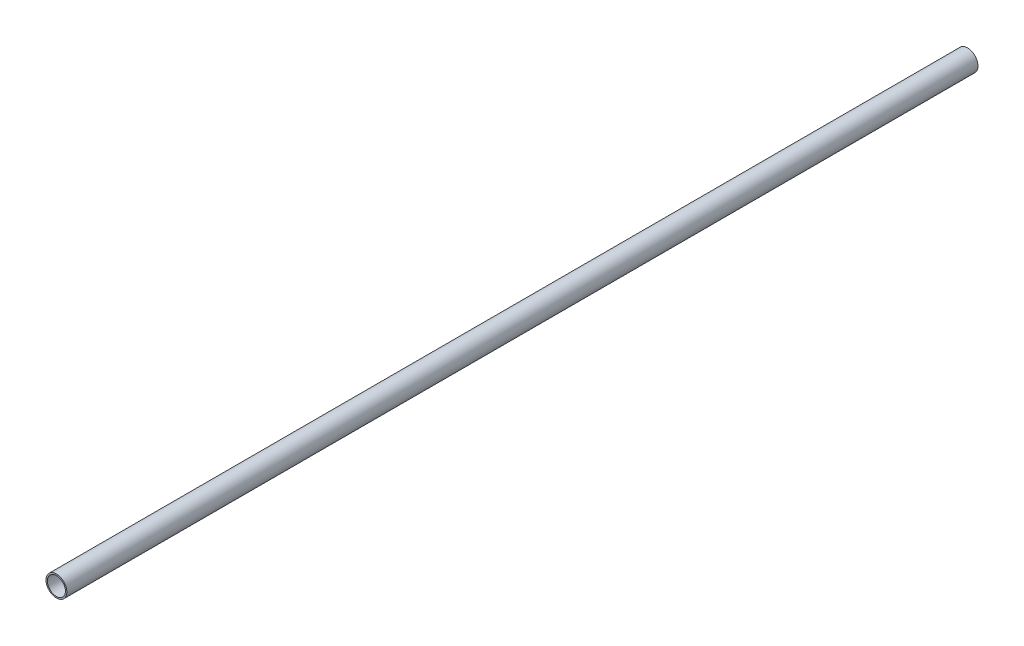
ISO-10303-21;
HEADER;
FILE_DESCRIPTION(('STEP AP214'),'2;1');
FILE_NAME('part.step','',(''),(''),'','','');
FILE_SCHEMA(('AUTOMOTIVE_DESIGN { 1 0 10303 214 1 1 1 1 }'));
ENDSEC;
DATA;
#1=APPLICATION_CONTEXT('core data for automotive mechanical design processes');
#2=APPLICATION_PROTOCOL_DEFINITION('international standard','automotive_design',2000,#1);
#3=PRODUCT_CONTEXT('',#1,'mechanical');
#4=PRODUCT('Part','Part','',(#3));
#5=PRODUCT_RELATED_PRODUCT_CATEGORY('part','',(#4));
#6=PRODUCT_DEFINITION_FORMATION('','',#4);
#7=PRODUCT_DEFINITION_CONTEXT('part definition',#1,'design');
#8=PRODUCT_DEFINITION('design','',#6,#7);
#9=PRODUCT_DEFINITION_SHAPE('','',#8);
#10=(LENGTH_UNIT() NAMED_UNIT(*) SI_UNIT(.MILLI.,.METRE.));
#11=(NAMED_UNIT(*) PLANE_ANGLE_UNIT() SI_UNIT($,.RADIAN.));
#12=(NAMED_UNIT(*) SI_UNIT($,.STERADIAN.) SOLID_ANGLE_UNIT());
#13=UNCERTAINTY_MEASURE_WITH_UNIT(LENGTH_MEASURE(1.E-05),#10,'distance_accuracy_value','');
#14=(GEOMETRIC_REPRESENTATION_CONTEXT(3) GLOBAL_UNCERTAINTY_ASSIGNED_CONTEXT((#13)) GLOBAL_UNIT_ASSIGNED_CONTEXT((#10,
#11,#12)) REPRESENTATION_CONTEXT('',''));
#15=CARTESIAN_POINT('',(0.,0.,0.));
#16=DIRECTION('',(0.,0.,1.));
#17=DIRECTION('',(1.,0.,0.));
#18=AXIS2_PLACEMENT_3D('',#15,#16,#17);
#19=CARTESIAN_POINT('',(0.,0.,1310.));
#20=DIRECTION('',(0.,0.,1.));
#21=DIRECTION('',(1.,0.,0.));
#22=AXIS2_PLACEMENT_3D('',#19,#20,#21);
#23=PLANE('',#22);
#24=CARTESIAN_POINT('',(0.,0.,1310.));
#25=DIRECTION('',(0.,0.,1.));
#26=DIRECTION('',(1.,0.,0.));
#27=AXIS2_PLACEMENT_3D('',#24,#25,#26);
#28=CIRCLE('',#27,15.);
#29=CARTESIAN_POINT('',(15.,0.,1310.));
#30=VERTEX_POINT('',#29);
#31=EDGE_CURVE('E10',#30,#30,#28,.T.);
#32=ORIENTED_EDGE('',*,*,#31,.T.);
#33=EDGE_LOOP('',(#32));
#34=FACE_BOUND('',#33,.T.);
#35=CARTESIAN_POINT('',(0.,0.,1310.));
#36=DIRECTION('',(0.,0.,1.));
#37=DIRECTION('',(1.,0.,0.));
#38=AXIS2_PLACEMENT_3D('',#35,#36,#37);
#39=CIRCLE('',#38,13.);
#40=CARTESIAN_POINT('',(13.,0.,1310.));
#41=VERTEX_POINT('',#40);
#42=EDGE_CURVE('E50',#41,#41,#39,.T.);
#43=ORIENTED_EDGE('',*,*,#42,.F.);
#44=EDGE_LOOP('',(#43));
#45=FACE_BOUND('',#44,.T.);
#46=ADVANCED_FACE('F37',(#34,#45),#23,.T.);
#47=CARTESIAN_POINT('',(0.,0.,0.));
#48=DIRECTION('',(0.,0.,1.));
#49=DIRECTION('',(1.,0.,0.));
#50=AXIS2_PLACEMENT_3D('',#47,#48,#49);
#51=PLANE('',#50);
#52=CARTESIAN_POINT('',(0.,0.,0.));
#53=DIRECTION('',(0.,0.,1.));
#54=DIRECTION('',(1.,0.,0.));
#55=AXIS2_PLACEMENT_3D('',#52,#53,#54);
#56=CIRCLE('',#55,15.);
#57=CARTESIAN_POINT('',(15.,0.,0.));
#58=VERTEX_POINT('',#57);
#59=EDGE_CURVE('E41',#58,#58,#56,.T.);
#60=ORIENTED_EDGE('',*,*,#59,.F.);
#61=EDGE_LOOP('',(#60));
#62=FACE_BOUND('',#61,.T.);
#63=CARTESIAN_POINT('',(0.,0.,0.));
#64=DIRECTION('',(0.,0.,1.));
#65=DIRECTION('',(1.,0.,0.));
#66=AXIS2_PLACEMENT_3D('',#63,#64,#65);
#67=CIRCLE('',#66,13.);
#68=CARTESIAN_POINT('',(13.,0.,0.));
#69=VERTEX_POINT('',#68);
#70=EDGE_CURVE('E52',#69,#69,#67,.T.);
#71=ORIENTED_EDGE('',*,*,#70,.T.);
#72=EDGE_LOOP('',(#71));
#73=FACE_BOUND('',#72,.T.);
#74=ADVANCED_FACE('F64',(#62,#73),#51,.F.);
#75=CARTESIAN_POINT('',(0.,0.,1310.));
#76=DIRECTION('',(0.,0.,-1.));
#77=DIRECTION('',(-1.,0.,0.));
#78=AXIS2_PLACEMENT_3D('',#75,#76,#77);
#79=CYLINDRICAL_SURFACE('',#78,15.);
#80=ORIENTED_EDGE('',*,*,#31,.F.);
#81=EDGE_LOOP('',(#80));
#82=FACE_BOUND('',#81,.T.);
#83=ORIENTED_EDGE('',*,*,#59,.T.);
#84=EDGE_LOOP('',(#83));
#85=FACE_BOUND('',#84,.T.);
#86=ADVANCED_FACE('F39',(#82,#85),#79,.T.);
#87=CARTESIAN_POINT('',(0.,0.,1310.));
#88=DIRECTION('',(0.,0.,-1.));
#89=DIRECTION('',(-1.,0.,0.));
#90=AXIS2_PLACEMENT_3D('',#87,#88,#89);
#91=CYLINDRICAL_SURFACE('',#90,13.);
#92=ORIENTED_EDGE('',*,*,#42,.T.);
#93=EDGE_LOOP('',(#92));
#94=FACE_BOUND('',#93,.T.);
#95=ORIENTED_EDGE('',*,*,#70,.F.);
#96=EDGE_LOOP('',(#95));
#97=FACE_BOUND('',#96,.T.);
#98=ADVANCED_FACE('F60',(#94,#97),#91,.F.);
#99=CLOSED_SHELL('',(#46,#74,#86,#98));
#100=MANIFOLD_SOLID_BREP('B2',#99);
#101=ADVANCED_BREP_SHAPE_REPRESENTATION('',(#18,#100),#14);
#102=SHAPE_DEFINITION_REPRESENTATION(#9,#101);
ENDSEC;
END-ISO-10303-21;
